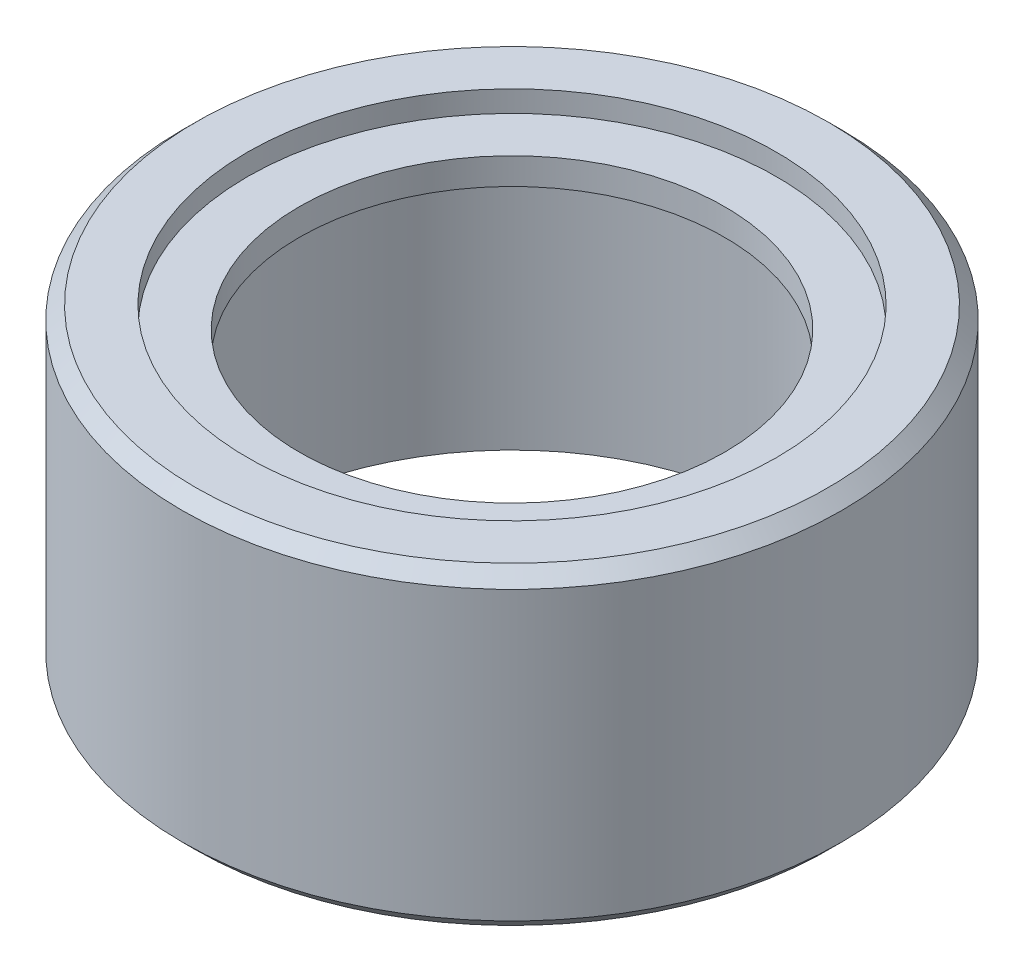
ISO-10303-21;
HEADER;
FILE_DESCRIPTION(('STEP AP214'),'2;1');
FILE_NAME('part.step','',(''),(''),'','','');
FILE_SCHEMA(('AUTOMOTIVE_DESIGN { 1 0 10303 214 1 1 1 1 }'));
ENDSEC;
DATA;
#1=APPLICATION_CONTEXT('core data for automotive mechanical design processes');
#2=APPLICATION_PROTOCOL_DEFINITION('international standard','automotive_design',2000,#1);
#3=PRODUCT_CONTEXT('',#1,'mechanical');
#4=PRODUCT('Part','Part','',(#3));
#5=PRODUCT_RELATED_PRODUCT_CATEGORY('part','',(#4));
#6=PRODUCT_DEFINITION_FORMATION('','',#4);
#7=PRODUCT_DEFINITION_CONTEXT('part definition',#1,'design');
#8=PRODUCT_DEFINITION('design','',#6,#7);
#9=PRODUCT_DEFINITION_SHAPE('','',#8);
#10=(LENGTH_UNIT() NAMED_UNIT(*) SI_UNIT(.MILLI.,.METRE.));
#11=(NAMED_UNIT(*) PLANE_ANGLE_UNIT() SI_UNIT($,.RADIAN.));
#12=(NAMED_UNIT(*) SI_UNIT($,.STERADIAN.) SOLID_ANGLE_UNIT());
#13=UNCERTAINTY_MEASURE_WITH_UNIT(LENGTH_MEASURE(1.E-05),#10,'distance_accuracy_value','');
#14=(GEOMETRIC_REPRESENTATION_CONTEXT(3) GLOBAL_UNCERTAINTY_ASSIGNED_CONTEXT((#13)) GLOBAL_UNIT_ASSIGNED_CONTEXT((#10,
#11,#12)) REPRESENTATION_CONTEXT('',''));
#15=CARTESIAN_POINT('',(0.,0.,0.));
#16=DIRECTION('',(0.,0.,1.));
#17=DIRECTION('',(1.,0.,0.));
#18=AXIS2_PLACEMENT_3D('',#15,#16,#17);
#19=CARTESIAN_POINT('',(0.,0.2499999999787,0.));
#20=DIRECTION('',(0.,1.,0.));
#21=DIRECTION('',(0.,0.,-1.));
#22=AXIS2_PLACEMENT_3D('',#19,#20,#21);
#23=CONICAL_SURFACE('',#22,12.14999999998,0.785398163397448);
#24=CARTESIAN_POINT('',(0.,0.5,0.));
#25=DIRECTION('',(0.,1.,0.));
#26=DIRECTION('',(-1.,0.,0.));
#27=AXIS2_PLACEMENT_3D('',#24,#25,#26);
#28=CIRCLE('',#27,12.4);
#29=CARTESIAN_POINT('',(0.,0.499999999999366,12.4000000000006));
#30=VERTEX_POINT('',#29);
#31=CARTESIAN_POINT('',(-12.4,0.5,0.));
#32=VERTEX_POINT('',#31);
#33=EDGE_CURVE('E20',#30,#32,#28,.T.);
#34=ORIENTED_EDGE('',*,*,#33,.F.);
#35=DIRECTION('',(0.,-0.707106781186548,-0.707106781186548));
#36=VECTOR('',#35,1.);
#37=CARTESIAN_POINT('',(0.,0.2499999999787,12.14999999998));
#38=LINE('',#37,#36);
#39=CARTESIAN_POINT('',(0.,-6.50417220082744E-13,11.9000000000006));
#40=VERTEX_POINT('',#39);
#41=EDGE_CURVE('E11',#30,#40,#38,.T.);
#42=ORIENTED_EDGE('',*,*,#41,.T.);
#43=CARTESIAN_POINT('',(0.,0.,0.));
#44=DIRECTION('',(0.,1.,0.));
#45=DIRECTION('',(1.,0.,0.));
#46=AXIS2_PLACEMENT_3D('',#43,#44,#45);
#47=CIRCLE('',#46,11.9);
#48=EDGE_CURVE('E126',#40,#40,#47,.T.);
#49=ORIENTED_EDGE('',*,*,#48,.T.);
#50=ORIENTED_EDGE('',*,*,#41,.F.);
#51=CARTESIAN_POINT('',(0.,0.5,0.));
#52=DIRECTION('',(0.,1.,0.));
#53=DIRECTION('',(-1.,0.,0.));
#54=AXIS2_PLACEMENT_3D('',#51,#52,#53);
#55=CIRCLE('',#54,12.4);
#56=EDGE_CURVE('E135',#32,#30,#55,.T.);
#57=ORIENTED_EDGE('',*,*,#56,.F.);
#58=EDGE_LOOP('',(#34,#42,#49,#50,#57));
#59=FACE_BOUND('',#58,.T.);
#60=ADVANCED_FACE('F17',(#59),#23,.T.);
#61=CARTESIAN_POINT('',(0.,-0.59,0.));
#62=DIRECTION('',(0.,1.,0.));
#63=DIRECTION('',(1.,0.,0.));
#64=AXIS2_PLACEMENT_3D('',#61,#62,#63);
#65=CYLINDRICAL_SURFACE('',#64,12.4);
#66=CARTESIAN_POINT('',(0.,11.3,0.));
#67=DIRECTION('',(0.,1.,0.));
#68=DIRECTION('',(1.,0.,0.));
#69=AXIS2_PLACEMENT_3D('',#66,#67,#68);
#70=CIRCLE('',#69,12.4);
#71=CARTESIAN_POINT('',(-12.4,11.3,0.));
#72=VERTEX_POINT('',#71);
#73=CARTESIAN_POINT('',(0.,11.3,12.4));
#74=VERTEX_POINT('',#73);
#75=EDGE_CURVE('E84',#72,#74,#70,.T.);
#76=ORIENTED_EDGE('',*,*,#75,.F.);
#77=DIRECTION('',(0.,-1.,0.));
#78=VECTOR('',#77,1.);
#79=CARTESIAN_POINT('',(-12.4,-0.59,0.));
#80=LINE('',#79,#78);
#81=EDGE_CURVE('E85',#72,#32,#80,.T.);
#82=ORIENTED_EDGE('',*,*,#81,.T.);
#83=ORIENTED_EDGE('',*,*,#56,.T.);
#84=ORIENTED_EDGE('',*,*,#33,.T.);
#85=ORIENTED_EDGE('',*,*,#81,.F.);
#86=CARTESIAN_POINT('',(0.,11.3,0.));
#87=DIRECTION('',(0.,1.,0.));
#88=DIRECTION('',(1.,0.,0.));
#89=AXIS2_PLACEMENT_3D('',#86,#87,#88);
#90=CIRCLE('',#89,12.4);
#91=EDGE_CURVE('E79',#74,#72,#90,.T.);
#92=ORIENTED_EDGE('',*,*,#91,.F.);
#93=EDGE_LOOP('',(#76,#82,#83,#84,#85,#92));
#94=FACE_BOUND('',#93,.T.);
#95=ADVANCED_FACE('F81',(#94),#65,.T.);
#96=CARTESIAN_POINT('',(0.,11.55000000004,0.));
#97=DIRECTION('',(0.,-1.,0.));
#98=DIRECTION('',(0.,0.,-1.));
#99=AXIS2_PLACEMENT_3D('',#96,#97,#98);
#100=CONICAL_SURFACE('',#99,12.14999999996,0.785398163397448);
#101=ORIENTED_EDGE('',*,*,#75,.T.);
#102=DIRECTION('',(0.,0.707106781186548,-0.707106781186548));
#103=VECTOR('',#102,1.);
#104=CARTESIAN_POINT('',(0.,11.55000000004,12.14999999996));
#105=LINE('',#104,#103);
#106=CARTESIAN_POINT('',(0.,11.8,11.9));
#107=VERTEX_POINT('',#106);
#108=EDGE_CURVE('E88',#74,#107,#105,.T.);
#109=ORIENTED_EDGE('',*,*,#108,.T.);
#110=CARTESIAN_POINT('',(0.,11.8,0.));
#111=DIRECTION('',(0.,1.,0.));
#112=DIRECTION('',(1.,0.,0.));
#113=AXIS2_PLACEMENT_3D('',#110,#111,#112);
#114=CIRCLE('',#113,11.9);
#115=EDGE_CURVE('E93',#107,#107,#114,.T.);
#116=ORIENTED_EDGE('',*,*,#115,.F.);
#117=ORIENTED_EDGE('',*,*,#108,.F.);
#118=ORIENTED_EDGE('',*,*,#91,.T.);
#119=EDGE_LOOP('',(#101,#109,#116,#117,#118));
#120=FACE_BOUND('',#119,.T.);
#121=ADVANCED_FACE('F91',(#120),#100,.T.);
#122=CARTESIAN_POINT('',(0.,11.8,0.));
#123=DIRECTION('',(0.,1.,0.));
#124=DIRECTION('',(1.,0.,0.));
#125=AXIS2_PLACEMENT_3D('',#122,#123,#124);
#126=PLANE('',#125);
#127=CARTESIAN_POINT('',(0.,11.8,0.));
#128=DIRECTION('',(0.,1.,0.));
#129=DIRECTION('',(1.,0.,0.));
#130=AXIS2_PLACEMENT_3D('',#127,#128,#129);
#131=CIRCLE('',#130,9.95);
#132=CARTESIAN_POINT('',(-9.95,11.8,0.));
#133=VERTEX_POINT('',#132);
#134=EDGE_CURVE('E102',#133,#133,#131,.T.);
#135=ORIENTED_EDGE('',*,*,#134,.F.);
#136=EDGE_LOOP('',(#135));
#137=FACE_BOUND('',#136,.T.);
#138=ORIENTED_EDGE('',*,*,#115,.T.);
#139=EDGE_LOOP('',(#138));
#140=FACE_BOUND('',#139,.T.);
#141=ADVANCED_FACE('F279',(#137,#140),#126,.T.);
#142=CARTESIAN_POINT('',(0.,-0.59,0.));
#143=DIRECTION('',(0.,1.,0.));
#144=DIRECTION('',(1.,0.,0.));
#145=AXIS2_PLACEMENT_3D('',#142,#143,#144);
#146=CYLINDRICAL_SURFACE('',#145,9.95);
#147=CARTESIAN_POINT('',(0.,11.,0.));
#148=DIRECTION('',(0.,1.,0.));
#149=DIRECTION('',(1.,0.,0.));
#150=AXIS2_PLACEMENT_3D('',#147,#148,#149);
#151=CIRCLE('',#150,9.95);
#152=CARTESIAN_POINT('',(-9.95,11.,0.));
#153=VERTEX_POINT('',#152);
#154=EDGE_CURVE('E132',#153,#153,#151,.T.);
#155=ORIENTED_EDGE('',*,*,#154,.F.);
#156=DIRECTION('',(0.,1.,0.));
#157=VECTOR('',#156,1.);
#158=CARTESIAN_POINT('',(-9.95,-0.59,0.));
#159=LINE('',#158,#157);
#160=EDGE_CURVE('E125',#153,#133,#159,.T.);
#161=ORIENTED_EDGE('',*,*,#160,.T.);
#162=ORIENTED_EDGE('',*,*,#134,.T.);
#163=ORIENTED_EDGE('',*,*,#160,.F.);
#164=EDGE_LOOP('',(#155,#161,#162,#163));
#165=FACE_BOUND('',#164,.T.);
#166=ADVANCED_FACE('F268',(#165),#146,.F.);
#167=CARTESIAN_POINT('',(0.,11.,0.));
#168=DIRECTION('',(0.,1.,0.));
#169=DIRECTION('',(1.,0.,0.));
#170=AXIS2_PLACEMENT_3D('',#167,#168,#169);
#171=PLANE('',#170);
#172=CARTESIAN_POINT('',(0.,11.,0.));
#173=DIRECTION('',(0.,1.,0.));
#174=DIRECTION('',(1.,0.,0.));
#175=AXIS2_PLACEMENT_3D('',#172,#173,#174);
#176=CIRCLE('',#175,8.);
#177=CARTESIAN_POINT('',(-8.,11.,0.));
#178=VERTEX_POINT('',#177);
#179=EDGE_CURVE('E109',#178,#178,#176,.T.);
#180=ORIENTED_EDGE('',*,*,#179,.F.);
#181=EDGE_LOOP('',(#180));
#182=FACE_BOUND('',#181,.T.);
#183=ORIENTED_EDGE('',*,*,#154,.T.);
#184=EDGE_LOOP('',(#183));
#185=FACE_BOUND('',#184,.T.);
#186=ADVANCED_FACE('F166',(#182,#185),#171,.T.);
#187=CARTESIAN_POINT('',(0.,-0.59,0.));
#188=DIRECTION('',(0.,1.,0.));
#189=DIRECTION('',(1.,0.,0.));
#190=AXIS2_PLACEMENT_3D('',#187,#188,#189);
#191=CYLINDRICAL_SURFACE('',#190,8.);
#192=CARTESIAN_POINT('',(0.,10.,0.));
#193=DIRECTION('',(0.,1.,0.));
#194=DIRECTION('',(1.,0.,0.));
#195=AXIS2_PLACEMENT_3D('',#192,#193,#194);
#196=CIRCLE('',#195,8.);
#197=CARTESIAN_POINT('',(-8.,10.,0.));
#198=VERTEX_POINT('',#197);
#199=EDGE_CURVE('E110',#198,#198,#196,.T.);
#200=ORIENTED_EDGE('',*,*,#199,.F.);
#201=DIRECTION('',(0.,1.,0.));
#202=VECTOR('',#201,1.);
#203=CARTESIAN_POINT('',(-8.,-0.59,0.));
#204=LINE('',#203,#202);
#205=EDGE_CURVE('E105',#198,#178,#204,.T.);
#206=ORIENTED_EDGE('',*,*,#205,.T.);
#207=ORIENTED_EDGE('',*,*,#179,.T.);
#208=ORIENTED_EDGE('',*,*,#205,.F.);
#209=EDGE_LOOP('',(#200,#206,#207,#208));
#210=FACE_BOUND('',#209,.T.);
#211=ADVANCED_FACE('F157',(#210),#191,.F.);
#212=CARTESIAN_POINT('',(0.,10.,0.));
#213=DIRECTION('',(0.,1.,0.));
#214=DIRECTION('',(1.,0.,0.));
#215=AXIS2_PLACEMENT_3D('',#212,#213,#214);
#216=PLANE('',#215);
#217=ORIENTED_EDGE('',*,*,#199,.T.);
#218=EDGE_LOOP('',(#217));
#219=FACE_BOUND('',#218,.T.);
#220=CARTESIAN_POINT('',(0.,10.,0.));
#221=DIRECTION('',(0.,1.,0.));
#222=DIRECTION('',(1.,0.,0.));
#223=AXIS2_PLACEMENT_3D('',#220,#221,#222);
#224=CIRCLE('',#223,10.);
#225=CARTESIAN_POINT('',(-10.,10.,0.));
#226=VERTEX_POINT('',#225);
#227=EDGE_CURVE('E115',#226,#226,#224,.T.);
#228=ORIENTED_EDGE('',*,*,#227,.F.);
#229=EDGE_LOOP('',(#228));
#230=FACE_BOUND('',#229,.T.);
#231=ADVANCED_FACE('F155',(#219,#230),#216,.F.);
#232=CARTESIAN_POINT('',(0.,-0.59,0.));
#233=DIRECTION('',(0.,1.,0.));
#234=DIRECTION('',(1.,0.,0.));
#235=AXIS2_PLACEMENT_3D('',#232,#233,#234);
#236=CYLINDRICAL_SURFACE('',#235,10.);
#237=CARTESIAN_POINT('',(0.,0.,0.));
#238=DIRECTION('',(0.,1.,0.));
#239=DIRECTION('',(1.,0.,0.));
#240=AXIS2_PLACEMENT_3D('',#237,#238,#239);
#241=CIRCLE('',#240,10.);
#242=CARTESIAN_POINT('',(-10.,0.,0.));
#243=VERTEX_POINT('',#242);
#244=EDGE_CURVE('E116',#243,#243,#241,.T.);
#245=ORIENTED_EDGE('',*,*,#244,.F.);
#246=DIRECTION('',(0.,1.,0.));
#247=VECTOR('',#246,1.);
#248=CARTESIAN_POINT('',(-10.,-0.59,0.));
#249=LINE('',#248,#247);
#250=EDGE_CURVE('E111',#243,#226,#249,.T.);
#251=ORIENTED_EDGE('',*,*,#250,.T.);
#252=ORIENTED_EDGE('',*,*,#227,.T.);
#253=ORIENTED_EDGE('',*,*,#250,.F.);
#254=EDGE_LOOP('',(#245,#251,#252,#253));
#255=FACE_BOUND('',#254,.T.);
#256=ADVANCED_FACE('F152',(#255),#236,.F.);
#257=CARTESIAN_POINT('',(0.,0.,0.));
#258=DIRECTION('',(0.,1.,0.));
#259=DIRECTION('',(1.,0.,0.));
#260=AXIS2_PLACEMENT_3D('',#257,#258,#259);
#261=PLANE('',#260);
#262=ORIENTED_EDGE('',*,*,#244,.T.);
#263=EDGE_LOOP('',(#262));
#264=FACE_BOUND('',#263,.T.);
#265=ORIENTED_EDGE('',*,*,#48,.F.);
#266=EDGE_LOOP('',(#265));
#267=FACE_BOUND('',#266,.T.);
#268=ADVANCED_FACE('F149',(#264,#267),#261,.F.);
#269=CLOSED_SHELL('',(#60,#95,#121,#141,#166,#186,#211,#231,#256,#268));
#270=MANIFOLD_SOLID_BREP('B1',#269);
#271=ADVANCED_BREP_SHAPE_REPRESENTATION('',(#18,#270),#14);
#272=SHAPE_DEFINITION_REPRESENTATION(#9,#271);
ENDSEC;
END-ISO-10303-21;
